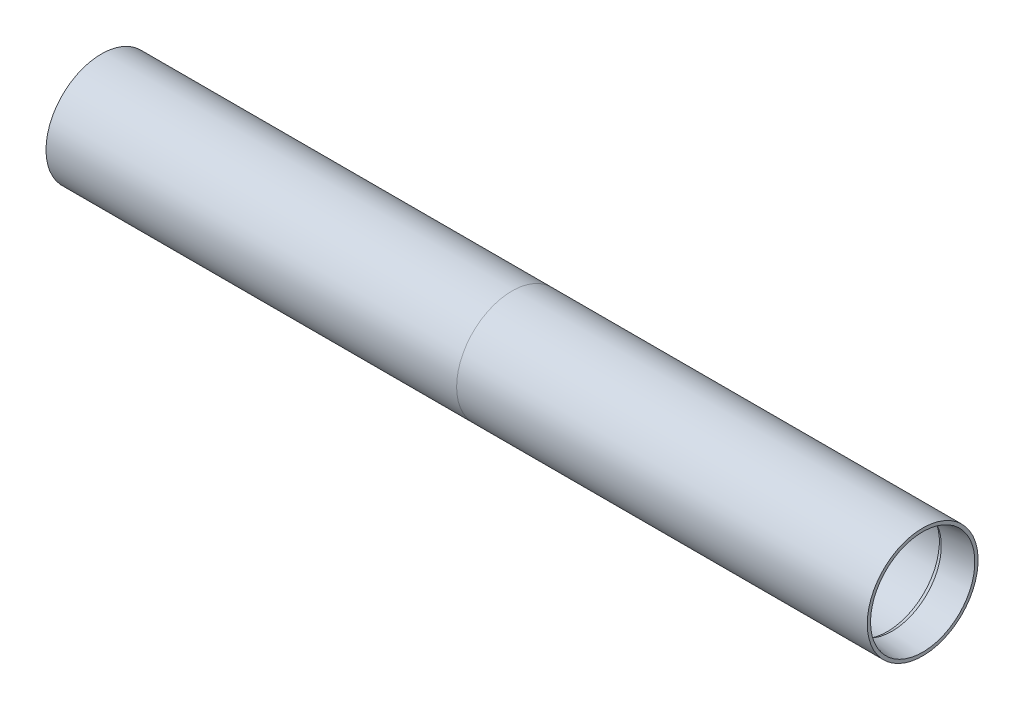
ISO-10303-21;
HEADER;
FILE_DESCRIPTION(('STEP AP214'),'2;1');
FILE_NAME('part.step','',(''),(''),'','','');
FILE_SCHEMA(('AUTOMOTIVE_DESIGN { 1 0 10303 214 1 1 1 1 }'));
ENDSEC;
DATA;
#1=APPLICATION_CONTEXT('core data for automotive mechanical design processes');
#2=APPLICATION_PROTOCOL_DEFINITION('international standard','automotive_design',2000,#1);
#3=PRODUCT_CONTEXT('',#1,'mechanical');
#4=PRODUCT('Part','Part','',(#3));
#5=PRODUCT_RELATED_PRODUCT_CATEGORY('part','',(#4));
#6=PRODUCT_DEFINITION_FORMATION('','',#4);
#7=PRODUCT_DEFINITION_CONTEXT('part definition',#1,'design');
#8=PRODUCT_DEFINITION('design','',#6,#7);
#9=PRODUCT_DEFINITION_SHAPE('','',#8);
#10=(LENGTH_UNIT() NAMED_UNIT(*) SI_UNIT(.MILLI.,.METRE.));
#11=(NAMED_UNIT(*) PLANE_ANGLE_UNIT() SI_UNIT($,.RADIAN.));
#12=(NAMED_UNIT(*) SI_UNIT($,.STERADIAN.) SOLID_ANGLE_UNIT());
#13=UNCERTAINTY_MEASURE_WITH_UNIT(LENGTH_MEASURE(1.E-05),#10,'distance_accuracy_value','');
#14=(GEOMETRIC_REPRESENTATION_CONTEXT(3) GLOBAL_UNCERTAINTY_ASSIGNED_CONTEXT((#13)) GLOBAL_UNIT_ASSIGNED_CONTEXT((#10,
#11,#12)) REPRESENTATION_CONTEXT('',''));
#15=CARTESIAN_POINT('',(0.,0.,0.));
#16=DIRECTION('',(0.,0.,1.));
#17=DIRECTION('',(1.,0.,0.));
#18=AXIS2_PLACEMENT_3D('',#15,#16,#17);
#19=CARTESIAN_POINT('',(214.991284425725,0.,0.));
#20=DIRECTION('',(-1.,0.,0.));
#21=DIRECTION('',(0.,0.,1.));
#22=AXIS2_PLACEMENT_3D('',#19,#20,#21);
#23=CONICAL_SURFACE('',#22,23.9880505773021,0.08726646259971);
#24=CARTESIAN_POINT('',(200.,0.,0.));
#25=DIRECTION('',(-1.,0.,0.));
#26=DIRECTION('',(0.,0.,1.));
#27=AXIS2_PLACEMENT_3D('',#24,#25,#26);
#28=CIRCLE('',#27,25.2996180162457);
#29=CARTESIAN_POINT('',(200.,0.,25.2996180162457));
#30=VERTEX_POINT('',#29);
#31=EDGE_CURVE('E78',#30,#30,#28,.T.);
#32=ORIENTED_EDGE('',*,*,#31,.F.);
#33=EDGE_LOOP('',(#32));
#34=FACE_BOUND('',#33,.T.);
#35=CARTESIAN_POINT('',(214.991284425725,0.,0.));
#36=DIRECTION('',(-1.,0.,0.));
#37=DIRECTION('',(0.,0.,1.));
#38=AXIS2_PLACEMENT_3D('',#35,#36,#37);
#39=CIRCLE('',#38,23.9880505773021);
#40=CARTESIAN_POINT('',(214.991284425725,0.,23.9880505773021));
#41=VERTEX_POINT('',#40);
#42=EDGE_CURVE('E11',#41,#41,#39,.T.);
#43=ORIENTED_EDGE('',*,*,#42,.T.);
#44=EDGE_LOOP('',(#43));
#45=FACE_BOUND('',#44,.T.);
#46=ADVANCED_FACE('F59',(#34,#45),#23,.T.);
#47=CARTESIAN_POINT('',(214.991284425725,0.,-23.9880505773021));
#48=DIRECTION('',(-1.,0.,0.));
#49=DIRECTION('',(0.,0.,1.));
#50=AXIS2_PLACEMENT_3D('',#47,#48,#49);
#51=PLANE('',#50);
#52=ORIENTED_EDGE('',*,*,#42,.F.);
#53=EDGE_LOOP('',(#52));
#54=FACE_BOUND('',#53,.T.);
#55=CARTESIAN_POINT('',(214.991284425725,0.,0.));
#56=DIRECTION('',(-1.,0.,0.));
#57=DIRECTION('',(0.,0.,1.));
#58=AXIS2_PLACEMENT_3D('',#55,#56,#57);
#59=CIRCLE('',#58,22.9880505773021);
#60=CARTESIAN_POINT('',(214.991284425725,0.,22.9880505773021));
#61=VERTEX_POINT('',#60);
#62=EDGE_CURVE('E65',#61,#61,#59,.T.);
#63=ORIENTED_EDGE('',*,*,#62,.T.);
#64=EDGE_LOOP('',(#63));
#65=FACE_BOUND('',#64,.T.);
#66=ADVANCED_FACE('F85',(#54,#65),#51,.F.);
#67=CARTESIAN_POINT('',(0.,0.,0.));
#68=DIRECTION('',(-1.,0.,0.));
#69=DIRECTION('',(0.,0.,1.));
#70=AXIS2_PLACEMENT_3D('',#67,#68,#69);
#71=CYLINDRICAL_SURFACE('',#70,22.9880505773021);
#72=ORIENTED_EDGE('',*,*,#62,.F.);
#73=EDGE_LOOP('',(#72));
#74=FACE_BOUND('',#73,.T.);
#75=CARTESIAN_POINT('',(185.008715574275,0.,0.));
#76=DIRECTION('',(-1.,0.,0.));
#77=DIRECTION('',(0.,0.,1.));
#78=AXIS2_PLACEMENT_3D('',#75,#76,#77);
#79=CIRCLE('',#78,22.9880505773021);
#80=CARTESIAN_POINT('',(185.008715574275,0.,22.9880505773021));
#81=VERTEX_POINT('',#80);
#82=EDGE_CURVE('E69',#81,#81,#79,.T.);
#83=ORIENTED_EDGE('',*,*,#82,.T.);
#84=EDGE_LOOP('',(#83));
#85=FACE_BOUND('',#84,.T.);
#86=ADVANCED_FACE('F89',(#74,#85),#71,.F.);
#87=CARTESIAN_POINT('',(185.008715574275,0.,-22.9880505773021));
#88=DIRECTION('',(1.,0.,0.));
#89=DIRECTION('',(0.,0.,-1.));
#90=AXIS2_PLACEMENT_3D('',#87,#88,#89);
#91=PLANE('',#90);
#92=ORIENTED_EDGE('',*,*,#82,.F.);
#93=EDGE_LOOP('',(#92));
#94=FACE_BOUND('',#93,.T.);
#95=CARTESIAN_POINT('',(185.008715574275,0.,0.));
#96=DIRECTION('',(-1.,0.,0.));
#97=DIRECTION('',(0.,0.,1.));
#98=AXIS2_PLACEMENT_3D('',#95,#96,#97);
#99=CIRCLE('',#98,23.9880505773021);
#100=CARTESIAN_POINT('',(185.008715574275,0.,23.9880505773021));
#101=VERTEX_POINT('',#100);
#102=EDGE_CURVE('E73',#101,#101,#99,.T.);
#103=ORIENTED_EDGE('',*,*,#102,.T.);
#104=EDGE_LOOP('',(#103));
#105=FACE_BOUND('',#104,.T.);
#106=ADVANCED_FACE('F94',(#94,#105),#91,.F.);
#107=CARTESIAN_POINT('',(200.,0.,0.));
#108=DIRECTION('',(1.,0.,0.));
#109=DIRECTION('',(0.,0.,-1.));
#110=AXIS2_PLACEMENT_3D('',#107,#108,#109);
#111=CONICAL_SURFACE('',#110,25.2996180162457,0.08726646259971);
#112=ORIENTED_EDGE('',*,*,#102,.F.);
#113=EDGE_LOOP('',(#112));
#114=FACE_BOUND('',#113,.T.);
#115=ORIENTED_EDGE('',*,*,#31,.T.);
#116=EDGE_LOOP('',(#115));
#117=FACE_BOUND('',#116,.T.);
#118=ADVANCED_FACE('F82',(#114,#117),#111,.T.);
#119=CLOSED_SHELL('',(#46,#66,#86,#106,#118));
#120=MANIFOLD_SOLID_BREP('B2_NOT_SHOWN',#119);
#121=CARTESIAN_POINT('',(0.,0.,0.));
#122=DIRECTION('',(-1.,0.,0.));
#123=DIRECTION('',(0.,0.,1.));
#124=AXIS2_PLACEMENT_3D('',#121,#122,#123);
#125=CYLINDRICAL_SURFACE('',#124,27.);
#126=CARTESIAN_POINT('',(200.,0.,0.));
#127=DIRECTION('',(-1.,0.,0.));
#128=DIRECTION('',(0.,0.,1.));
#129=AXIS2_PLACEMENT_3D('',#126,#127,#128);
#130=CIRCLE('',#129,27.);
#131=CARTESIAN_POINT('',(200.,0.,27.));
#132=VERTEX_POINT('',#131);
#133=EDGE_CURVE('E190',#132,#132,#130,.T.);
#134=ORIENTED_EDGE('',*,*,#133,.F.);
#135=EDGE_LOOP('',(#134));
#136=FACE_BOUND('',#135,.T.);
#137=CARTESIAN_POINT('',(400.,0.,0.));
#138=DIRECTION('',(-1.,0.,0.));
#139=DIRECTION('',(0.,0.,1.));
#140=AXIS2_PLACEMENT_3D('',#137,#138,#139);
#141=CIRCLE('',#140,27.);
#142=CARTESIAN_POINT('',(400.,0.,27.));
#143=VERTEX_POINT('',#142);
#144=EDGE_CURVE('E58',#143,#143,#141,.T.);
#145=ORIENTED_EDGE('',*,*,#144,.T.);
#146=EDGE_LOOP('',(#145));
#147=FACE_BOUND('',#146,.T.);
#148=ADVANCED_FACE('F162',(#136,#147),#125,.T.);
#149=CARTESIAN_POINT('',(400.,0.,-27.));
#150=DIRECTION('',(-1.,0.,0.));
#151=DIRECTION('',(0.,0.,1.));
#152=AXIS2_PLACEMENT_3D('',#149,#150,#151);
#153=PLANE('',#152);
#154=ORIENTED_EDGE('',*,*,#144,.F.);
#155=EDGE_LOOP('',(#154));
#156=FACE_BOUND('',#155,.T.);
#157=CARTESIAN_POINT('',(400.,0.,0.));
#158=DIRECTION('',(-1.,0.,0.));
#159=DIRECTION('',(0.,0.,1.));
#160=AXIS2_PLACEMENT_3D('',#157,#158,#159);
#161=CIRCLE('',#160,25.4);
#162=CARTESIAN_POINT('',(400.,0.,25.4));
#163=VERTEX_POINT('',#162);
#164=EDGE_CURVE('E168',#163,#163,#161,.T.);
#165=ORIENTED_EDGE('',*,*,#164,.T.);
#166=EDGE_LOOP('',(#165));
#167=FACE_BOUND('',#166,.T.);
#168=ADVANCED_FACE('F197',(#156,#167),#153,.F.);
#169=CARTESIAN_POINT('',(385.,0.,0.));
#170=DIRECTION('',(1.,0.,0.));
#171=DIRECTION('',(0.,0.,-1.));
#172=AXIS2_PLACEMENT_3D('',#169,#170,#171);
#173=CONICAL_SURFACE('',#172,24.0876700471112,0.0872664625997102);
#174=ORIENTED_EDGE('',*,*,#164,.F.);
#175=EDGE_LOOP('',(#174));
#176=FACE_BOUND('',#175,.T.);
#177=CARTESIAN_POINT('',(385.,0.,0.));
#178=DIRECTION('',(-1.,0.,0.));
#179=DIRECTION('',(0.,0.,1.));
#180=AXIS2_PLACEMENT_3D('',#177,#178,#179);
#181=CIRCLE('',#180,24.0876700471112);
#182=CARTESIAN_POINT('',(385.,0.,24.0876700471112));
#183=VERTEX_POINT('',#182);
#184=EDGE_CURVE('E172',#183,#183,#181,.T.);
#185=ORIENTED_EDGE('',*,*,#184,.T.);
#186=EDGE_LOOP('',(#185));
#187=FACE_BOUND('',#186,.T.);
#188=ADVANCED_FACE('F201',(#176,#187),#173,.F.);
#189=CARTESIAN_POINT('',(382.726977845302,0.,0.));
#190=DIRECTION('',(-1.,0.,0.));
#191=DIRECTION('',(0.,0.,1.));
#192=AXIS2_PLACEMENT_3D('',#189,#190,#191);
#193=CONICAL_SURFACE('',#192,25.4,0.523598775598285);
#194=ORIENTED_EDGE('',*,*,#184,.F.);
#195=EDGE_LOOP('',(#194));
#196=FACE_BOUND('',#195,.T.);
#197=CARTESIAN_POINT('',(382.726977845302,0.,0.));
#198=DIRECTION('',(-1.,0.,0.));
#199=DIRECTION('',(0.,0.,1.));
#200=AXIS2_PLACEMENT_3D('',#197,#198,#199);
#201=CIRCLE('',#200,25.4);
#202=CARTESIAN_POINT('',(382.726977845302,0.,25.4));
#203=VERTEX_POINT('',#202);
#204=EDGE_CURVE('E176',#203,#203,#201,.T.);
#205=ORIENTED_EDGE('',*,*,#204,.T.);
#206=EDGE_LOOP('',(#205));
#207=FACE_BOUND('',#206,.T.);
#208=ADVANCED_FACE('F206',(#196,#207),#193,.F.);
#209=CARTESIAN_POINT('',(0.,0.,0.));
#210=DIRECTION('',(-1.,0.,0.));
#211=DIRECTION('',(0.,0.,1.));
#212=AXIS2_PLACEMENT_3D('',#209,#210,#211);
#213=CYLINDRICAL_SURFACE('',#212,25.4);
#214=ORIENTED_EDGE('',*,*,#204,.F.);
#215=EDGE_LOOP('',(#214));
#216=FACE_BOUND('',#215,.T.);
#217=CARTESIAN_POINT('',(217.273022154698,0.,0.));
#218=DIRECTION('',(-1.,0.,0.));
#219=DIRECTION('',(0.,0.,1.));
#220=AXIS2_PLACEMENT_3D('',#217,#218,#219);
#221=CIRCLE('',#220,25.4);
#222=CARTESIAN_POINT('',(217.273022154698,0.,25.4));
#223=VERTEX_POINT('',#222);
#224=EDGE_CURVE('E181',#223,#223,#221,.T.);
#225=ORIENTED_EDGE('',*,*,#224,.T.);
#226=EDGE_LOOP('',(#225));
#227=FACE_BOUND('',#226,.T.);
#228=ADVANCED_FACE('F212',(#216,#227),#213,.F.);
#229=CARTESIAN_POINT('',(215.,0.,0.));
#230=DIRECTION('',(1.,0.,0.));
#231=DIRECTION('',(0.,0.,-1.));
#232=AXIS2_PLACEMENT_3D('',#229,#230,#231);
#233=CONICAL_SURFACE('',#232,24.0876700471112,0.52359877559829);
#234=ORIENTED_EDGE('',*,*,#224,.F.);
#235=EDGE_LOOP('',(#234));
#236=FACE_BOUND('',#235,.T.);
#237=CARTESIAN_POINT('',(215.,0.,0.));
#238=DIRECTION('',(-1.,0.,0.));
#239=DIRECTION('',(0.,0.,1.));
#240=AXIS2_PLACEMENT_3D('',#237,#238,#239);
#241=CIRCLE('',#240,24.0876700471112);
#242=CARTESIAN_POINT('',(215.,0.,24.0876700471112));
#243=VERTEX_POINT('',#242);
#244=EDGE_CURVE('E184',#243,#243,#241,.T.);
#245=ORIENTED_EDGE('',*,*,#244,.T.);
#246=EDGE_LOOP('',(#245));
#247=FACE_BOUND('',#246,.T.);
#248=ADVANCED_FACE('F216',(#236,#247),#233,.F.);
#249=CARTESIAN_POINT('',(200.,0.,0.));
#250=DIRECTION('',(-1.,0.,0.));
#251=DIRECTION('',(0.,0.,1.));
#252=AXIS2_PLACEMENT_3D('',#249,#250,#251);
#253=CONICAL_SURFACE('',#252,25.4,0.0872664625997099);
#254=ORIENTED_EDGE('',*,*,#244,.F.);
#255=EDGE_LOOP('',(#254));
#256=FACE_BOUND('',#255,.T.);
#257=CARTESIAN_POINT('',(200.,0.,0.));
#258=DIRECTION('',(-1.,0.,0.));
#259=DIRECTION('',(0.,0.,1.));
#260=AXIS2_PLACEMENT_3D('',#257,#258,#259);
#261=CIRCLE('',#260,25.4);
#262=CARTESIAN_POINT('',(200.,0.,25.4));
#263=VERTEX_POINT('',#262);
#264=EDGE_CURVE('E187',#263,#263,#261,.T.);
#265=ORIENTED_EDGE('',*,*,#264,.T.);
#266=EDGE_LOOP('',(#265));
#267=FACE_BOUND('',#266,.T.);
#268=ADVANCED_FACE('F220',(#256,#267),#253,.F.);
#269=CARTESIAN_POINT('',(200.,0.,-27.));
#270=DIRECTION('',(1.,0.,0.));
#271=DIRECTION('',(0.,0.,-1.));
#272=AXIS2_PLACEMENT_3D('',#269,#270,#271);
#273=PLANE('',#272);
#274=ORIENTED_EDGE('',*,*,#264,.F.);
#275=EDGE_LOOP('',(#274));
#276=FACE_BOUND('',#275,.T.);
#277=ORIENTED_EDGE('',*,*,#133,.T.);
#278=EDGE_LOOP('',(#277));
#279=FACE_BOUND('',#278,.T.);
#280=ADVANCED_FACE('F194',(#276,#279),#273,.F.);
#281=CLOSED_SHELL('',(#148,#168,#188,#208,#228,#248,#268,#280));
#282=MANIFOLD_SOLID_BREP('B6_NOT_SHOWN',#281);
#283=CARTESIAN_POINT('',(185.,0.,0.));
#284=DIRECTION('',(-1.,0.,0.));
#285=DIRECTION('',(0.,0.,1.));
#286=AXIS2_PLACEMENT_3D('',#283,#284,#285);
#287=CONICAL_SURFACE('',#286,24.0876700471112,0.52359877559829);
#288=CARTESIAN_POINT('',(182.726977845302,0.,0.));
#289=DIRECTION('',(-1.,0.,0.));
#290=DIRECTION('',(0.,0.,1.));
#291=AXIS2_PLACEMENT_3D('',#288,#289,#290);
#292=CIRCLE('',#291,25.4);
#293=CARTESIAN_POINT('',(182.726977845302,0.,25.4));
#294=VERTEX_POINT('',#293);
#295=EDGE_CURVE('E337',#294,#294,#292,.T.);
#296=ORIENTED_EDGE('',*,*,#295,.T.);
#297=EDGE_LOOP('',(#296));
#298=FACE_BOUND('',#297,.T.);
#299=CARTESIAN_POINT('',(185.,0.,0.));
#300=DIRECTION('',(-1.,0.,0.));
#301=DIRECTION('',(0.,0.,1.));
#302=AXIS2_PLACEMENT_3D('',#299,#300,#301);
#303=CIRCLE('',#302,24.0876700471112);
#304=CARTESIAN_POINT('',(185.,0.,24.0876700471112));
#305=VERTEX_POINT('',#304);
#306=EDGE_CURVE('E161',#305,#305,#303,.T.);
#307=ORIENTED_EDGE('',*,*,#306,.F.);
#308=EDGE_LOOP('',(#307));
#309=FACE_BOUND('',#308,.T.);
#310=ADVANCED_FACE('F315',(#298,#309),#287,.F.);
#311=CARTESIAN_POINT('',(200.,0.,0.));
#312=DIRECTION('',(1.,0.,0.));
#313=DIRECTION('',(0.,0.,-1.));
#314=AXIS2_PLACEMENT_3D('',#311,#312,#313);
#315=CONICAL_SURFACE('',#314,25.4,0.0872664625997099);
#316=ORIENTED_EDGE('',*,*,#306,.T.);
#317=EDGE_LOOP('',(#316));
#318=FACE_BOUND('',#317,.T.);
#319=CARTESIAN_POINT('',(200.,0.,0.));
#320=DIRECTION('',(-1.,0.,0.));
#321=DIRECTION('',(0.,0.,1.));
#322=AXIS2_PLACEMENT_3D('',#319,#320,#321);
#323=CIRCLE('',#322,25.4);
#324=CARTESIAN_POINT('',(200.,0.,25.4));
#325=VERTEX_POINT('',#324);
#326=EDGE_CURVE('E321',#325,#325,#323,.T.);
#327=ORIENTED_EDGE('',*,*,#326,.F.);
#328=EDGE_LOOP('',(#327));
#329=FACE_BOUND('',#328,.T.);
#330=ADVANCED_FACE('F361',(#318,#329),#315,.F.);
#331=CARTESIAN_POINT('',(200.,0.,0.));
#332=DIRECTION('',(-1.,0.,0.));
#333=DIRECTION('',(0.,0.,1.));
#334=AXIS2_PLACEMENT_3D('',#331,#332,#333);
#335=PLANE('',#334);
#336=CARTESIAN_POINT('',(200.,0.,0.));
#337=DIRECTION('',(-1.,0.,0.));
#338=DIRECTION('',(0.,0.,1.));
#339=AXIS2_PLACEMENT_3D('',#336,#337,#338);
#340=CIRCLE('',#339,27.);
#341=CARTESIAN_POINT('',(200.,0.,27.));
#342=VERTEX_POINT('',#341);
#343=EDGE_CURVE('E325',#342,#342,#340,.T.);
#344=ORIENTED_EDGE('',*,*,#343,.F.);
#345=EDGE_LOOP('',(#344));
#346=FACE_BOUND('',#345,.T.);
#347=ORIENTED_EDGE('',*,*,#326,.T.);
#348=EDGE_LOOP('',(#347));
#349=FACE_BOUND('',#348,.T.);
#350=ADVANCED_FACE('F357',(#346,#349),#335,.F.);
#351=CARTESIAN_POINT('',(0.,0.,0.));
#352=DIRECTION('',(-1.,0.,0.));
#353=DIRECTION('',(0.,0.,1.));
#354=AXIS2_PLACEMENT_3D('',#351,#352,#353);
#355=CYLINDRICAL_SURFACE('',#354,27.);
#356=ORIENTED_EDGE('',*,*,#343,.T.);
#357=EDGE_LOOP('',(#356));
#358=FACE_BOUND('',#357,.T.);
#359=CARTESIAN_POINT('',(0.,0.,0.));
#360=DIRECTION('',(-1.,0.,0.));
#361=DIRECTION('',(0.,0.,1.));
#362=AXIS2_PLACEMENT_3D('',#359,#360,#361);
#363=CIRCLE('',#362,27.);
#364=CARTESIAN_POINT('',(0.,0.,27.));
#365=VERTEX_POINT('',#364);
#366=EDGE_CURVE('E329',#365,#365,#363,.T.);
#367=ORIENTED_EDGE('',*,*,#366,.F.);
#368=EDGE_LOOP('',(#367));
#369=FACE_BOUND('',#368,.T.);
#370=ADVANCED_FACE('F351',(#358,#369),#355,.T.);
#371=CARTESIAN_POINT('',(0.,0.,0.));
#372=DIRECTION('',(-1.,0.,0.));
#373=DIRECTION('',(0.,0.,1.));
#374=AXIS2_PLACEMENT_3D('',#371,#372,#373);
#375=PLANE('',#374);
#376=ORIENTED_EDGE('',*,*,#366,.T.);
#377=EDGE_LOOP('',(#376));
#378=FACE_BOUND('',#377,.T.);
#379=CARTESIAN_POINT('',(0.,0.,0.));
#380=DIRECTION('',(-1.,0.,0.));
#381=DIRECTION('',(0.,0.,1.));
#382=AXIS2_PLACEMENT_3D('',#379,#380,#381);
#383=CIRCLE('',#382,25.4);
#384=CARTESIAN_POINT('',(0.,0.,25.4));
#385=VERTEX_POINT('',#384);
#386=EDGE_CURVE('E334',#385,#385,#383,.T.);
#387=ORIENTED_EDGE('',*,*,#386,.F.);
#388=EDGE_LOOP('',(#387));
#389=FACE_BOUND('',#388,.T.);
#390=ADVANCED_FACE('F346',(#378,#389),#375,.T.);
#391=CARTESIAN_POINT('',(0.,0.,0.));
#392=DIRECTION('',(-1.,0.,0.));
#393=DIRECTION('',(0.,0.,1.));
#394=AXIS2_PLACEMENT_3D('',#391,#392,#393);
#395=CYLINDRICAL_SURFACE('',#394,25.4);
#396=ORIENTED_EDGE('',*,*,#295,.F.);
#397=EDGE_LOOP('',(#396));
#398=FACE_BOUND('',#397,.T.);
#399=ORIENTED_EDGE('',*,*,#386,.T.);
#400=EDGE_LOOP('',(#399));
#401=FACE_BOUND('',#400,.T.);
#402=ADVANCED_FACE('F343',(#398,#401),#395,.F.);
#403=CLOSED_SHELL('',(#310,#330,#350,#370,#390,#402));
#404=MANIFOLD_SOLID_BREP('B53',#403);
#405=ADVANCED_BREP_SHAPE_REPRESENTATION('',(#18,#120,#282,#404),#14);
#406=SHAPE_DEFINITION_REPRESENTATION(#9,#405);
ENDSEC;
END-ISO-10303-21;
